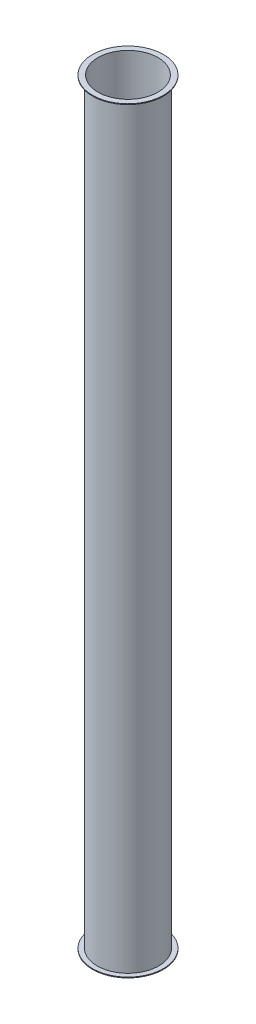
ISO-10303-21;
HEADER;
FILE_DESCRIPTION(('STEP AP214'),'2;1');
FILE_NAME('part.step','',(''),(''),'','','');
FILE_SCHEMA(('AUTOMOTIVE_DESIGN { 1 0 10303 214 1 1 1 1 }'));
ENDSEC;
DATA;
#1=APPLICATION_CONTEXT('core data for automotive mechanical design processes');
#2=APPLICATION_PROTOCOL_DEFINITION('international standard','automotive_design',2000,#1);
#3=PRODUCT_CONTEXT('',#1,'mechanical');
#4=PRODUCT('Part','Part','',(#3));
#5=PRODUCT_RELATED_PRODUCT_CATEGORY('part','',(#4));
#6=PRODUCT_DEFINITION_FORMATION('','',#4);
#7=PRODUCT_DEFINITION_CONTEXT('part definition',#1,'design');
#8=PRODUCT_DEFINITION('design','',#6,#7);
#9=PRODUCT_DEFINITION_SHAPE('','',#8);
#10=(LENGTH_UNIT() NAMED_UNIT(*) SI_UNIT(.MILLI.,.METRE.));
#11=(NAMED_UNIT(*) PLANE_ANGLE_UNIT() SI_UNIT($,.RADIAN.));
#12=(NAMED_UNIT(*) SI_UNIT($,.STERADIAN.) SOLID_ANGLE_UNIT());
#13=UNCERTAINTY_MEASURE_WITH_UNIT(LENGTH_MEASURE(1.E-05),#10,'distance_accuracy_value','');
#14=(GEOMETRIC_REPRESENTATION_CONTEXT(3) GLOBAL_UNCERTAINTY_ASSIGNED_CONTEXT((#13)) GLOBAL_UNIT_ASSIGNED_CONTEXT((#10,
#11,#12)) REPRESENTATION_CONTEXT('',''));
#15=CARTESIAN_POINT('',(0.,0.,0.));
#16=DIRECTION('',(0.,0.,1.));
#17=DIRECTION('',(1.,0.,0.));
#18=AXIS2_PLACEMENT_3D('',#15,#16,#17);
#19=CARTESIAN_POINT('',(-42.5,984.,0.));
#20=DIRECTION('',(0.,1.,0.));
#21=DIRECTION('',(1.,0.,0.));
#22=AXIS2_PLACEMENT_3D('',#19,#20,#21);
#23=PLANE('',#22);
#24=CARTESIAN_POINT('',(0.,984.,0.));
#25=DIRECTION('',(0.,1.,0.));
#26=DIRECTION('',(-1.,0.,0.));
#27=AXIS2_PLACEMENT_3D('',#24,#25,#26);
#28=CIRCLE('',#27,39.);
#29=CARTESIAN_POINT('',(-39.,984.,0.));
#30=VERTEX_POINT('',#29);
#31=EDGE_CURVE('E62',#30,#30,#28,.T.);
#32=ORIENTED_EDGE('',*,*,#31,.F.);
#33=EDGE_LOOP('',(#32));
#34=FACE_BOUND('',#33,.T.);
#35=CARTESIAN_POINT('',(0.,984.,0.));
#36=DIRECTION('',(0.,1.,0.));
#37=DIRECTION('',(-1.,0.,0.));
#38=AXIS2_PLACEMENT_3D('',#35,#36,#37);
#39=CIRCLE('',#38,46.);
#40=CARTESIAN_POINT('',(-46.,984.,0.));
#41=VERTEX_POINT('',#40);
#42=EDGE_CURVE('E9',#41,#41,#39,.T.);
#43=ORIENTED_EDGE('',*,*,#42,.T.);
#44=EDGE_LOOP('',(#43));
#45=FACE_BOUND('',#44,.T.);
#46=ADVANCED_FACE('F14',(#34,#45),#23,.T.);
#47=CARTESIAN_POINT('',(0.,983.5,0.));
#48=DIRECTION('',(0.,1.,0.));
#49=DIRECTION('',(-1.,0.,0.));
#50=AXIS2_PLACEMENT_3D('',#47,#48,#49);
#51=CYLINDRICAL_SURFACE('',#50,46.);
#52=CARTESIAN_POINT('',(0.,983.,0.));
#53=DIRECTION('',(0.,1.,0.));
#54=DIRECTION('',(-1.,0.,0.));
#55=AXIS2_PLACEMENT_3D('',#52,#53,#54);
#56=CIRCLE('',#55,46.);
#57=CARTESIAN_POINT('',(-46.,983.,0.));
#58=VERTEX_POINT('',#57);
#59=EDGE_CURVE('E25',#58,#58,#56,.T.);
#60=ORIENTED_EDGE('',*,*,#59,.T.);
#61=EDGE_LOOP('',(#60));
#62=FACE_BOUND('',#61,.T.);
#63=ORIENTED_EDGE('',*,*,#42,.F.);
#64=EDGE_LOOP('',(#63));
#65=FACE_BOUND('',#64,.T.);
#66=ADVANCED_FACE('F101',(#62,#65),#51,.T.);
#67=CARTESIAN_POINT('',(-43.,983.,0.));
#68=DIRECTION('',(0.,-1.,0.));
#69=DIRECTION('',(0.,0.,-1.));
#70=AXIS2_PLACEMENT_3D('',#67,#68,#69);
#71=PLANE('',#70);
#72=CARTESIAN_POINT('',(0.,983.,0.));
#73=DIRECTION('',(0.,1.,0.));
#74=DIRECTION('',(-1.,0.,0.));
#75=AXIS2_PLACEMENT_3D('',#72,#73,#74);
#76=CIRCLE('',#75,40.);
#77=CARTESIAN_POINT('',(-40.,983.,0.));
#78=VERTEX_POINT('',#77);
#79=EDGE_CURVE('E72',#78,#78,#76,.T.);
#80=ORIENTED_EDGE('',*,*,#79,.T.);
#81=EDGE_LOOP('',(#80));
#82=FACE_BOUND('',#81,.T.);
#83=ORIENTED_EDGE('',*,*,#59,.F.);
#84=EDGE_LOOP('',(#83));
#85=FACE_BOUND('',#84,.T.);
#86=ADVANCED_FACE('F85',(#82,#85),#71,.T.);
#87=CARTESIAN_POINT('',(0.,492.,0.));
#88=DIRECTION('',(0.,1.,0.));
#89=DIRECTION('',(-1.,0.,0.));
#90=AXIS2_PLACEMENT_3D('',#87,#88,#89);
#91=CYLINDRICAL_SURFACE('',#90,40.);
#92=CARTESIAN_POINT('',(0.,0.999999999999943,0.));
#93=DIRECTION('',(0.,1.,0.));
#94=DIRECTION('',(-1.,0.,0.));
#95=AXIS2_PLACEMENT_3D('',#92,#93,#94);
#96=CIRCLE('',#95,40.);
#97=CARTESIAN_POINT('',(-40.,0.999999999999941,0.));
#98=VERTEX_POINT('',#97);
#99=EDGE_CURVE('E76',#98,#98,#96,.T.);
#100=ORIENTED_EDGE('',*,*,#99,.T.);
#101=EDGE_LOOP('',(#100));
#102=FACE_BOUND('',#101,.T.);
#103=ORIENTED_EDGE('',*,*,#79,.F.);
#104=EDGE_LOOP('',(#103));
#105=FACE_BOUND('',#104,.T.);
#106=ADVANCED_FACE('F88',(#102,#105),#91,.T.);
#107=CARTESIAN_POINT('',(-43.,0.99999999999994,0.));
#108=DIRECTION('',(0.,1.,0.));
#109=DIRECTION('',(1.,0.,0.));
#110=AXIS2_PLACEMENT_3D('',#107,#108,#109);
#111=PLANE('',#110);
#112=ORIENTED_EDGE('',*,*,#99,.F.);
#113=EDGE_LOOP('',(#112));
#114=FACE_BOUND('',#113,.T.);
#115=CARTESIAN_POINT('',(0.,0.999999999999943,0.));
#116=DIRECTION('',(0.,1.,0.));
#117=DIRECTION('',(-1.,0.,0.));
#118=AXIS2_PLACEMENT_3D('',#115,#116,#117);
#119=CIRCLE('',#118,46.);
#120=CARTESIAN_POINT('',(-46.,0.99999999999994,0.));
#121=VERTEX_POINT('',#120);
#122=EDGE_CURVE('E18',#121,#121,#119,.T.);
#123=ORIENTED_EDGE('',*,*,#122,.T.);
#124=EDGE_LOOP('',(#123));
#125=FACE_BOUND('',#124,.T.);
#126=ADVANCED_FACE('F90',(#114,#125),#111,.T.);
#127=CARTESIAN_POINT('',(0.,0.499999999999972,0.));
#128=DIRECTION('',(0.,1.,0.));
#129=DIRECTION('',(-1.,0.,0.));
#130=AXIS2_PLACEMENT_3D('',#127,#128,#129);
#131=CYLINDRICAL_SURFACE('',#130,46.);
#132=CARTESIAN_POINT('',(0.,0.,0.));
#133=DIRECTION('',(0.,1.,0.));
#134=DIRECTION('',(-1.,0.,0.));
#135=AXIS2_PLACEMENT_3D('',#132,#133,#134);
#136=CIRCLE('',#135,46.);
#137=CARTESIAN_POINT('',(-46.,0.,0.));
#138=VERTEX_POINT('',#137);
#139=EDGE_CURVE('E68',#138,#138,#136,.T.);
#140=ORIENTED_EDGE('',*,*,#139,.T.);
#141=EDGE_LOOP('',(#140));
#142=FACE_BOUND('',#141,.T.);
#143=ORIENTED_EDGE('',*,*,#122,.F.);
#144=EDGE_LOOP('',(#143));
#145=FACE_BOUND('',#144,.T.);
#146=ADVANCED_FACE('F98',(#142,#145),#131,.T.);
#147=CARTESIAN_POINT('',(-42.5,0.,0.));
#148=DIRECTION('',(0.,-1.,0.));
#149=DIRECTION('',(0.,0.,-1.));
#150=AXIS2_PLACEMENT_3D('',#147,#148,#149);
#151=PLANE('',#150);
#152=CARTESIAN_POINT('',(0.,0.,0.));
#153=DIRECTION('',(0.,1.,0.));
#154=DIRECTION('',(-1.,0.,0.));
#155=AXIS2_PLACEMENT_3D('',#152,#153,#154);
#156=CIRCLE('',#155,39.);
#157=CARTESIAN_POINT('',(-39.,0.,0.));
#158=VERTEX_POINT('',#157);
#159=EDGE_CURVE('E57',#158,#158,#156,.T.);
#160=ORIENTED_EDGE('',*,*,#159,.T.);
#161=EDGE_LOOP('',(#160));
#162=FACE_BOUND('',#161,.T.);
#163=ORIENTED_EDGE('',*,*,#139,.F.);
#164=EDGE_LOOP('',(#163));
#165=FACE_BOUND('',#164,.T.);
#166=ADVANCED_FACE('F58',(#162,#165),#151,.T.);
#167=CARTESIAN_POINT('',(0.,492.,0.));
#168=DIRECTION('',(0.,1.,0.));
#169=DIRECTION('',(-1.,0.,0.));
#170=AXIS2_PLACEMENT_3D('',#167,#168,#169);
#171=CYLINDRICAL_SURFACE('',#170,39.);
#172=ORIENTED_EDGE('',*,*,#31,.T.);
#173=EDGE_LOOP('',(#172));
#174=FACE_BOUND('',#173,.T.);
#175=ORIENTED_EDGE('',*,*,#159,.F.);
#176=EDGE_LOOP('',(#175));
#177=FACE_BOUND('',#176,.T.);
#178=ADVANCED_FACE('F16',(#174,#177),#171,.F.);
#179=CLOSED_SHELL('',(#46,#66,#86,#106,#126,#146,#166,#178));
#180=MANIFOLD_SOLID_BREP('B1',#179);
#181=ADVANCED_BREP_SHAPE_REPRESENTATION('',(#18,#180),#14);
#182=SHAPE_DEFINITION_REPRESENTATION(#9,#181);
ENDSEC;
END-ISO-10303-21;
